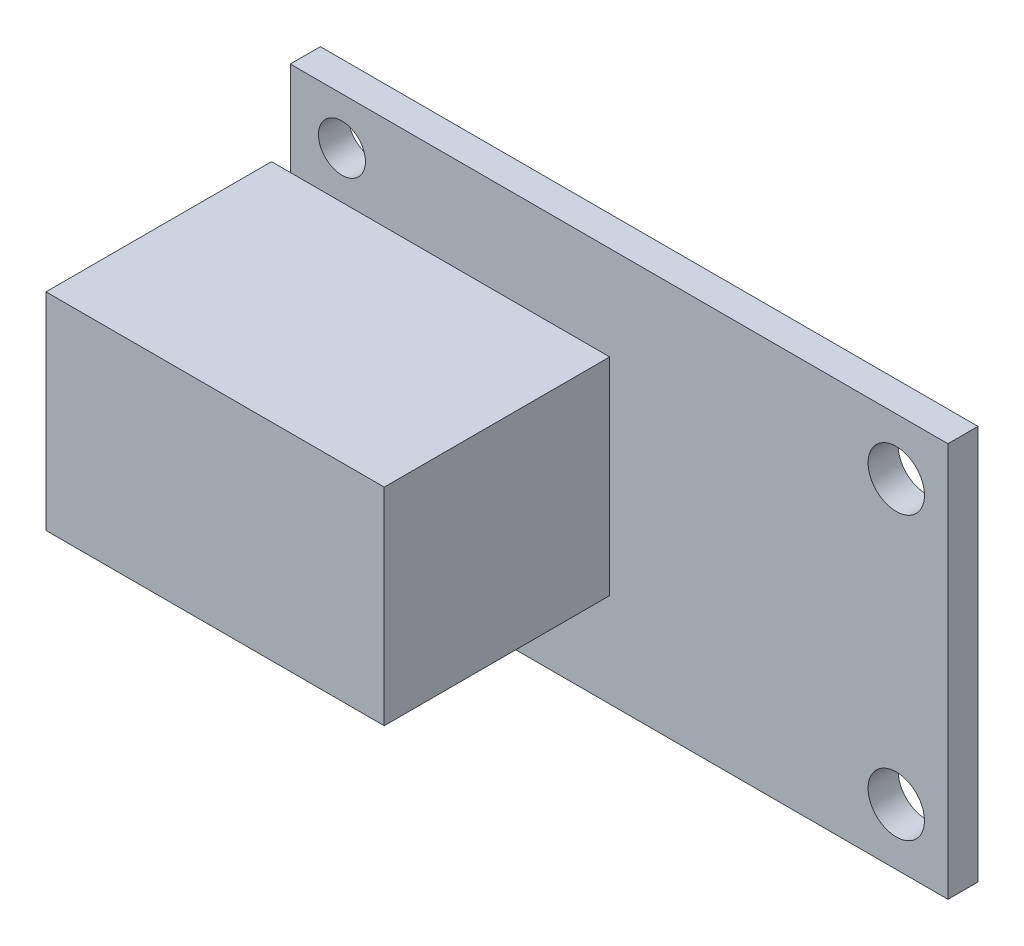
ISO-10303-21;
HEADER;
FILE_DESCRIPTION(('STEP AP214'),'2;1');
FILE_NAME('part.step','',(''),(''),'','','');
FILE_SCHEMA(('AUTOMOTIVE_DESIGN { 1 0 10303 214 1 1 1 1 }'));
ENDSEC;
DATA;
#1=APPLICATION_CONTEXT('core data for automotive mechanical design processes');
#2=APPLICATION_PROTOCOL_DEFINITION('international standard','automotive_design',2000,#1);
#3=PRODUCT_CONTEXT('',#1,'mechanical');
#4=PRODUCT('Part','Part','',(#3));
#5=PRODUCT_RELATED_PRODUCT_CATEGORY('part','',(#4));
#6=PRODUCT_DEFINITION_FORMATION('','',#4);
#7=PRODUCT_DEFINITION_CONTEXT('part definition',#1,'design');
#8=PRODUCT_DEFINITION('design','',#6,#7);
#9=PRODUCT_DEFINITION_SHAPE('','',#8);
#10=(LENGTH_UNIT() NAMED_UNIT(*) SI_UNIT(.MILLI.,.METRE.));
#11=(NAMED_UNIT(*) PLANE_ANGLE_UNIT() SI_UNIT($,.RADIAN.));
#12=(NAMED_UNIT(*) SI_UNIT($,.STERADIAN.) SOLID_ANGLE_UNIT());
#13=UNCERTAINTY_MEASURE_WITH_UNIT(LENGTH_MEASURE(1.E-05),#10,'distance_accuracy_value','');
#14=(GEOMETRIC_REPRESENTATION_CONTEXT(3) GLOBAL_UNCERTAINTY_ASSIGNED_CONTEXT((#13)) GLOBAL_UNIT_ASSIGNED_CONTEXT((#10,
#11,#12)) REPRESENTATION_CONTEXT('',''));
#15=CARTESIAN_POINT('',(0.,0.,0.));
#16=DIRECTION('',(0.,0.,1.));
#17=DIRECTION('',(1.,0.,0.));
#18=AXIS2_PLACEMENT_3D('',#15,#16,#17);
#19=CARTESIAN_POINT('',(-17.5,10.5,1.6));
#20=DIRECTION('',(1.,0.,0.));
#21=DIRECTION('',(0.,1.,0.));
#22=AXIS2_PLACEMENT_3D('',#19,#20,#21);
#23=PLANE('',#22);
#24=DIRECTION('',(0.,-1.,0.));
#25=VECTOR('',#24,1.);
#26=CARTESIAN_POINT('',(-17.5,10.5,0.));
#27=LINE('',#26,#25);
#28=CARTESIAN_POINT('',(-17.5,10.5,0.));
#29=VERTEX_POINT('',#28);
#30=CARTESIAN_POINT('',(-17.5,-10.5,0.));
#31=VERTEX_POINT('',#30);
#32=EDGE_CURVE('E132',#29,#31,#27,.T.);
#33=ORIENTED_EDGE('',*,*,#32,.T.);
#34=DIRECTION('',(0.,0.,-1.));
#35=VECTOR('',#34,1.);
#36=CARTESIAN_POINT('',(-17.5,-10.5,1.6));
#37=LINE('',#36,#35);
#38=CARTESIAN_POINT('',(-17.5,-10.5,1.6));
#39=VERTEX_POINT('',#38);
#40=EDGE_CURVE('E40',#39,#31,#37,.T.);
#41=ORIENTED_EDGE('',*,*,#40,.F.);
#42=DIRECTION('',(0.,-1.,0.));
#43=VECTOR('',#42,1.);
#44=CARTESIAN_POINT('',(-17.5,10.5,1.6));
#45=LINE('',#44,#43);
#46=CARTESIAN_POINT('',(-17.5,-5.49999999999999,1.6));
#47=VERTEX_POINT('',#46);
#48=EDGE_CURVE('E145',#47,#39,#45,.T.);
#49=ORIENTED_EDGE('',*,*,#48,.F.);
#50=CARTESIAN_POINT('',(-17.5,5.5,1.6));
#51=VERTEX_POINT('',#50);
#52=EDGE_CURVE('E144',#51,#47,#45,.T.);
#53=ORIENTED_EDGE('',*,*,#52,.F.);
#54=CARTESIAN_POINT('',(-17.5,10.5,1.6));
#55=VERTEX_POINT('',#54);
#56=EDGE_CURVE('E141',#55,#51,#45,.T.);
#57=ORIENTED_EDGE('',*,*,#56,.F.);
#58=DIRECTION('',(0.,0.,-1.));
#59=VECTOR('',#58,1.);
#60=CARTESIAN_POINT('',(-17.5,10.5,1.6));
#61=LINE('',#60,#59);
#62=EDGE_CURVE('E150',#55,#29,#61,.T.);
#63=ORIENTED_EDGE('',*,*,#62,.T.);
#64=EDGE_LOOP('',(#33,#41,#49,#53,#57,#63));
#65=FACE_BOUND('',#64,.T.);
#66=ADVANCED_FACE('F37',(#65),#23,.F.);
#67=CARTESIAN_POINT('',(-17.5,-10.5,1.6));
#68=DIRECTION('',(0.,1.,0.));
#69=DIRECTION('',(0.,0.,1.));
#70=AXIS2_PLACEMENT_3D('',#67,#68,#69);
#71=PLANE('',#70);
#72=DIRECTION('',(1.,0.,0.));
#73=VECTOR('',#72,1.);
#74=CARTESIAN_POINT('',(-17.5,-10.5,0.));
#75=LINE('',#74,#73);
#76=CARTESIAN_POINT('',(17.5,-10.5,0.));
#77=VERTEX_POINT('',#76);
#78=EDGE_CURVE('E135',#31,#77,#75,.T.);
#79=ORIENTED_EDGE('',*,*,#78,.T.);
#80=DIRECTION('',(0.,0.,-1.));
#81=VECTOR('',#80,1.);
#82=CARTESIAN_POINT('',(17.5,-10.5,1.6));
#83=LINE('',#82,#81);
#84=CARTESIAN_POINT('',(17.5,-10.5,1.6));
#85=VERTEX_POINT('',#84);
#86=EDGE_CURVE('E161',#85,#77,#83,.T.);
#87=ORIENTED_EDGE('',*,*,#86,.F.);
#88=DIRECTION('',(1.,0.,0.));
#89=VECTOR('',#88,1.);
#90=CARTESIAN_POINT('',(-17.5,-10.5,1.6));
#91=LINE('',#90,#89);
#92=EDGE_CURVE('E143',#39,#85,#91,.T.);
#93=ORIENTED_EDGE('',*,*,#92,.F.);
#94=ORIENTED_EDGE('',*,*,#40,.T.);
#95=EDGE_LOOP('',(#79,#87,#93,#94));
#96=FACE_BOUND('',#95,.T.);
#97=ADVANCED_FACE('F171',(#96),#71,.F.);
#98=CARTESIAN_POINT('',(17.5,10.5,1.6));
#99=DIRECTION('',(-1.,0.,0.));
#100=DIRECTION('',(0.,-1.,0.));
#101=AXIS2_PLACEMENT_3D('',#98,#99,#100);
#102=PLANE('',#101);
#103=DIRECTION('',(0.,1.,0.));
#104=VECTOR('',#103,1.);
#105=CARTESIAN_POINT('',(17.5,10.5,0.));
#106=LINE('',#105,#104);
#107=CARTESIAN_POINT('',(17.5,10.5,0.));
#108=VERTEX_POINT('',#107);
#109=EDGE_CURVE('E153',#77,#108,#106,.T.);
#110=ORIENTED_EDGE('',*,*,#109,.T.);
#111=DIRECTION('',(0.,0.,-1.));
#112=VECTOR('',#111,1.);
#113=CARTESIAN_POINT('',(17.5,10.5,1.6));
#114=LINE('',#113,#112);
#115=CARTESIAN_POINT('',(17.5,10.5,1.6));
#116=VERTEX_POINT('',#115);
#117=EDGE_CURVE('E159',#116,#108,#114,.T.);
#118=ORIENTED_EDGE('',*,*,#117,.F.);
#119=DIRECTION('',(0.,1.,0.));
#120=VECTOR('',#119,1.);
#121=CARTESIAN_POINT('',(17.5,10.5,1.6));
#122=LINE('',#121,#120);
#123=EDGE_CURVE('E147',#85,#116,#122,.T.);
#124=ORIENTED_EDGE('',*,*,#123,.F.);
#125=ORIENTED_EDGE('',*,*,#86,.T.);
#126=EDGE_LOOP('',(#110,#118,#124,#125));
#127=FACE_BOUND('',#126,.T.);
#128=ADVANCED_FACE('F180',(#127),#102,.F.);
#129=CARTESIAN_POINT('',(-17.5,10.5,1.6));
#130=DIRECTION('',(0.,-1.,0.));
#131=DIRECTION('',(0.,0.,-1.));
#132=AXIS2_PLACEMENT_3D('',#129,#130,#131);
#133=PLANE('',#132);
#134=DIRECTION('',(-1.,0.,0.));
#135=VECTOR('',#134,1.);
#136=CARTESIAN_POINT('',(-17.5,10.5,0.));
#137=LINE('',#136,#135);
#138=EDGE_CURVE('E155',#108,#29,#137,.T.);
#139=ORIENTED_EDGE('',*,*,#138,.T.);
#140=ORIENTED_EDGE('',*,*,#62,.F.);
#141=DIRECTION('',(-1.,0.,0.));
#142=VECTOR('',#141,1.);
#143=CARTESIAN_POINT('',(-17.5,10.5,1.6));
#144=LINE('',#143,#142);
#145=EDGE_CURVE('E149',#116,#55,#144,.T.);
#146=ORIENTED_EDGE('',*,*,#145,.F.);
#147=ORIENTED_EDGE('',*,*,#117,.T.);
#148=EDGE_LOOP('',(#139,#140,#146,#147));
#149=FACE_BOUND('',#148,.T.);
#150=ADVANCED_FACE('F183',(#149),#133,.F.);
#151=CARTESIAN_POINT('',(0.,0.,1.6));
#152=DIRECTION('',(0.,0.,1.));
#153=DIRECTION('',(1.,0.,0.));
#154=AXIS2_PLACEMENT_3D('',#151,#152,#153);
#155=PLANE('',#154);
#156=CARTESIAN_POINT('',(-14.75,-8.,1.6));
#157=DIRECTION('',(0.,0.,1.));
#158=DIRECTION('',(-1.,0.,0.));
#159=AXIS2_PLACEMENT_3D('',#156,#157,#158);
#160=CIRCLE('',#159,1.25);
#161=CARTESIAN_POINT('',(-16.,-8.,1.6));
#162=VERTEX_POINT('',#161);
#163=EDGE_CURVE('E212',#162,#162,#160,.T.);
#164=ORIENTED_EDGE('',*,*,#163,.F.);
#165=EDGE_LOOP('',(#164));
#166=FACE_BOUND('',#165,.T.);
#167=CARTESIAN_POINT('',(14.75,-7.5,1.6));
#168=DIRECTION('',(0.,0.,1.));
#169=DIRECTION('',(-1.,0.,0.));
#170=AXIS2_PLACEMENT_3D('',#167,#168,#169);
#171=CIRCLE('',#170,1.5);
#172=CARTESIAN_POINT('',(13.25,-7.5,1.6));
#173=VERTEX_POINT('',#172);
#174=EDGE_CURVE('E218',#173,#173,#171,.T.);
#175=ORIENTED_EDGE('',*,*,#174,.F.);
#176=EDGE_LOOP('',(#175));
#177=FACE_BOUND('',#176,.T.);
#178=CARTESIAN_POINT('',(14.75,7.5,1.6));
#179=DIRECTION('',(0.,0.,1.));
#180=DIRECTION('',(1.,0.,0.));
#181=AXIS2_PLACEMENT_3D('',#178,#179,#180);
#182=CIRCLE('',#181,1.49999999999999);
#183=CARTESIAN_POINT('',(16.25,7.5,1.6));
#184=VERTEX_POINT('',#183);
#185=EDGE_CURVE('E224',#184,#184,#182,.T.);
#186=ORIENTED_EDGE('',*,*,#185,.F.);
#187=EDGE_LOOP('',(#186));
#188=FACE_BOUND('',#187,.T.);
#189=CARTESIAN_POINT('',(-14.75,8.,1.6));
#190=DIRECTION('',(0.,0.,1.));
#191=DIRECTION('',(1.,0.,0.));
#192=AXIS2_PLACEMENT_3D('',#189,#190,#191);
#193=CIRCLE('',#192,1.25);
#194=CARTESIAN_POINT('',(-13.5,8.,1.6));
#195=VERTEX_POINT('',#194);
#196=EDGE_CURVE('E206',#195,#195,#193,.T.);
#197=ORIENTED_EDGE('',*,*,#196,.F.);
#198=EDGE_LOOP('',(#197));
#199=FACE_BOUND('',#198,.T.);
#200=DIRECTION('',(-1.,0.,0.));
#201=VECTOR('',#200,1.);
#202=CARTESIAN_POINT('',(-18.5,5.5,1.6));
#203=LINE('',#202,#201);
#204=CARTESIAN_POINT('',(-0.500000000000004,5.5,1.6));
#205=VERTEX_POINT('',#204);
#206=EDGE_CURVE('E53',#205,#51,#203,.T.);
#207=ORIENTED_EDGE('',*,*,#206,.F.);
#208=DIRECTION('',(0.,1.,0.));
#209=VECTOR('',#208,1.);
#210=CARTESIAN_POINT('',(-0.500000000000004,5.5,1.6));
#211=LINE('',#210,#209);
#212=CARTESIAN_POINT('',(-0.500000000000004,-5.5,1.6));
#213=VERTEX_POINT('',#212);
#214=EDGE_CURVE('E190',#213,#205,#211,.T.);
#215=ORIENTED_EDGE('',*,*,#214,.F.);
#216=DIRECTION('',(1.,0.,0.));
#217=VECTOR('',#216,1.);
#218=CARTESIAN_POINT('',(-18.5,-5.5,1.6));
#219=LINE('',#218,#217);
#220=EDGE_CURVE('E11',#47,#213,#219,.T.);
#221=ORIENTED_EDGE('',*,*,#220,.F.);
#222=ORIENTED_EDGE('',*,*,#48,.T.);
#223=ORIENTED_EDGE('',*,*,#92,.T.);
#224=ORIENTED_EDGE('',*,*,#123,.T.);
#225=ORIENTED_EDGE('',*,*,#145,.T.);
#226=ORIENTED_EDGE('',*,*,#56,.T.);
#227=EDGE_LOOP('',(#207,#215,#221,#222,#223,#224,#225,#226));
#228=FACE_BOUND('',#227,.T.);
#229=ADVANCED_FACE('F184',(#166,#177,#188,#199,#228),#155,.T.);
#230=CARTESIAN_POINT('',(0.,0.,0.));
#231=DIRECTION('',(0.,0.,1.));
#232=DIRECTION('',(1.,0.,0.));
#233=AXIS2_PLACEMENT_3D('',#230,#231,#232);
#234=PLANE('',#233);
#235=CARTESIAN_POINT('',(-14.75,-8.,0.));
#236=DIRECTION('',(0.,0.,1.));
#237=DIRECTION('',(-1.,0.,0.));
#238=AXIS2_PLACEMENT_3D('',#235,#236,#237);
#239=CIRCLE('',#238,1.25);
#240=CARTESIAN_POINT('',(-16.,-8.,0.));
#241=VERTEX_POINT('',#240);
#242=EDGE_CURVE('E215',#241,#241,#239,.T.);
#243=ORIENTED_EDGE('',*,*,#242,.T.);
#244=EDGE_LOOP('',(#243));
#245=FACE_BOUND('',#244,.T.);
#246=CARTESIAN_POINT('',(14.75,-7.5,0.));
#247=DIRECTION('',(0.,0.,1.));
#248=DIRECTION('',(-1.,0.,0.));
#249=AXIS2_PLACEMENT_3D('',#246,#247,#248);
#250=CIRCLE('',#249,1.5);
#251=CARTESIAN_POINT('',(13.25,-7.5,0.));
#252=VERTEX_POINT('',#251);
#253=EDGE_CURVE('E221',#252,#252,#250,.T.);
#254=ORIENTED_EDGE('',*,*,#253,.T.);
#255=EDGE_LOOP('',(#254));
#256=FACE_BOUND('',#255,.T.);
#257=CARTESIAN_POINT('',(14.75,7.5,0.));
#258=DIRECTION('',(0.,0.,1.));
#259=DIRECTION('',(1.,0.,0.));
#260=AXIS2_PLACEMENT_3D('',#257,#258,#259);
#261=CIRCLE('',#260,1.49999999999999);
#262=CARTESIAN_POINT('',(16.25,7.5,0.));
#263=VERTEX_POINT('',#262);
#264=EDGE_CURVE('E209',#263,#263,#261,.T.);
#265=ORIENTED_EDGE('',*,*,#264,.T.);
#266=EDGE_LOOP('',(#265));
#267=FACE_BOUND('',#266,.T.);
#268=CARTESIAN_POINT('',(-14.75,8.,0.));
#269=DIRECTION('',(0.,0.,1.));
#270=DIRECTION('',(1.,0.,0.));
#271=AXIS2_PLACEMENT_3D('',#268,#269,#270);
#272=CIRCLE('',#271,1.25);
#273=CARTESIAN_POINT('',(-13.5,8.,0.));
#274=VERTEX_POINT('',#273);
#275=EDGE_CURVE('E192',#274,#274,#272,.T.);
#276=ORIENTED_EDGE('',*,*,#275,.T.);
#277=EDGE_LOOP('',(#276));
#278=FACE_BOUND('',#277,.T.);
#279=ORIENTED_EDGE('',*,*,#32,.F.);
#280=ORIENTED_EDGE('',*,*,#138,.F.);
#281=ORIENTED_EDGE('',*,*,#109,.F.);
#282=ORIENTED_EDGE('',*,*,#78,.F.);
#283=EDGE_LOOP('',(#279,#280,#281,#282));
#284=FACE_BOUND('',#283,.T.);
#285=ADVANCED_FACE('F178',(#245,#256,#267,#278,#284),#234,.F.);
#286=CARTESIAN_POINT('',(0.,0.,1.6));
#287=DIRECTION('',(0.,0.,1.));
#288=DIRECTION('',(1.,0.,0.));
#289=AXIS2_PLACEMENT_3D('',#286,#287,#288);
#290=PLANE('',#289);
#291=CARTESIAN_POINT('',(-18.5,5.5,1.6));
#292=VERTEX_POINT('',#291);
#293=EDGE_CURVE('E189',#51,#292,#203,.T.);
#294=ORIENTED_EDGE('',*,*,#293,.F.);
#295=ORIENTED_EDGE('',*,*,#52,.T.);
#296=CARTESIAN_POINT('',(-18.5,-5.5,1.6));
#297=VERTEX_POINT('',#296);
#298=EDGE_CURVE('E46',#297,#47,#219,.T.);
#299=ORIENTED_EDGE('',*,*,#298,.F.);
#300=DIRECTION('',(0.,-1.,0.));
#301=VECTOR('',#300,1.);
#302=CARTESIAN_POINT('',(-18.5,5.5,1.6));
#303=LINE('',#302,#301);
#304=EDGE_CURVE('E131',#292,#297,#303,.T.);
#305=ORIENTED_EDGE('',*,*,#304,.F.);
#306=EDGE_LOOP('',(#294,#295,#299,#305));
#307=FACE_BOUND('',#306,.T.);
#308=ADVANCED_FACE('F188',(#307),#290,.F.);
#309=CARTESIAN_POINT('',(-18.5,5.5,13.6));
#310=DIRECTION('',(1.,0.,0.));
#311=DIRECTION('',(0.,0.,-1.));
#312=AXIS2_PLACEMENT_3D('',#309,#310,#311);
#313=PLANE('',#312);
#314=ORIENTED_EDGE('',*,*,#304,.T.);
#315=DIRECTION('',(0.,0.,-1.));
#316=VECTOR('',#315,1.);
#317=CARTESIAN_POINT('',(-18.5,-5.5,13.6));
#318=LINE('',#317,#316);
#319=CARTESIAN_POINT('',(-18.5,-5.5,13.6));
#320=VERTEX_POINT('',#319);
#321=EDGE_CURVE('E112',#320,#297,#318,.T.);
#322=ORIENTED_EDGE('',*,*,#321,.F.);
#323=DIRECTION('',(0.,-1.,0.));
#324=VECTOR('',#323,1.);
#325=CARTESIAN_POINT('',(-18.5,5.5,13.6));
#326=LINE('',#325,#324);
#327=CARTESIAN_POINT('',(-18.5,5.5,13.6));
#328=VERTEX_POINT('',#327);
#329=EDGE_CURVE('E119',#328,#320,#326,.T.);
#330=ORIENTED_EDGE('',*,*,#329,.F.);
#331=DIRECTION('',(0.,0.,-1.));
#332=VECTOR('',#331,1.);
#333=CARTESIAN_POINT('',(-18.5,5.5,13.6));
#334=LINE('',#333,#332);
#335=EDGE_CURVE('E197',#328,#292,#334,.T.);
#336=ORIENTED_EDGE('',*,*,#335,.T.);
#337=EDGE_LOOP('',(#314,#322,#330,#336));
#338=FACE_BOUND('',#337,.T.);
#339=ADVANCED_FACE('F129',(#338),#313,.F.);
#340=CARTESIAN_POINT('',(-18.5,-5.5,13.6));
#341=DIRECTION('',(0.,1.,0.));
#342=DIRECTION('',(0.,0.,1.));
#343=AXIS2_PLACEMENT_3D('',#340,#341,#342);
#344=PLANE('',#343);
#345=ORIENTED_EDGE('',*,*,#298,.T.);
#346=ORIENTED_EDGE('',*,*,#220,.T.);
#347=DIRECTION('',(0.,0.,-1.));
#348=VECTOR('',#347,1.);
#349=CARTESIAN_POINT('',(-0.500000000000004,-5.5,13.6));
#350=LINE('',#349,#348);
#351=CARTESIAN_POINT('',(-0.500000000000004,-5.5,13.6));
#352=VERTEX_POINT('',#351);
#353=EDGE_CURVE('E115',#352,#213,#350,.T.);
#354=ORIENTED_EDGE('',*,*,#353,.F.);
#355=DIRECTION('',(1.,0.,0.));
#356=VECTOR('',#355,1.);
#357=CARTESIAN_POINT('',(-18.5,-5.5,13.6));
#358=LINE('',#357,#356);
#359=EDGE_CURVE('E107',#320,#352,#358,.T.);
#360=ORIENTED_EDGE('',*,*,#359,.F.);
#361=ORIENTED_EDGE('',*,*,#321,.T.);
#362=EDGE_LOOP('',(#345,#346,#354,#360,#361));
#363=FACE_BOUND('',#362,.T.);
#364=ADVANCED_FACE('F110',(#363),#344,.F.);
#365=CARTESIAN_POINT('',(-0.500000000000004,5.5,13.6));
#366=DIRECTION('',(-1.,0.,0.));
#367=DIRECTION('',(0.,0.,1.));
#368=AXIS2_PLACEMENT_3D('',#365,#366,#367);
#369=PLANE('',#368);
#370=ORIENTED_EDGE('',*,*,#214,.T.);
#371=DIRECTION('',(0.,0.,-1.));
#372=VECTOR('',#371,1.);
#373=CARTESIAN_POINT('',(-0.500000000000004,5.5,13.6));
#374=LINE('',#373,#372);
#375=CARTESIAN_POINT('',(-0.500000000000004,5.5,13.6));
#376=VERTEX_POINT('',#375);
#377=EDGE_CURVE('E137',#376,#205,#374,.T.);
#378=ORIENTED_EDGE('',*,*,#377,.F.);
#379=DIRECTION('',(0.,1.,0.));
#380=VECTOR('',#379,1.);
#381=CARTESIAN_POINT('',(-0.500000000000004,5.5,13.6));
#382=LINE('',#381,#380);
#383=EDGE_CURVE('E118',#352,#376,#382,.T.);
#384=ORIENTED_EDGE('',*,*,#383,.F.);
#385=ORIENTED_EDGE('',*,*,#353,.T.);
#386=EDGE_LOOP('',(#370,#378,#384,#385));
#387=FACE_BOUND('',#386,.T.);
#388=ADVANCED_FACE('F203',(#387),#369,.F.);
#389=CARTESIAN_POINT('',(-18.5,5.5,13.6));
#390=DIRECTION('',(0.,-1.,0.));
#391=DIRECTION('',(0.,0.,-1.));
#392=AXIS2_PLACEMENT_3D('',#389,#390,#391);
#393=PLANE('',#392);
#394=ORIENTED_EDGE('',*,*,#206,.T.);
#395=ORIENTED_EDGE('',*,*,#293,.T.);
#396=ORIENTED_EDGE('',*,*,#335,.F.);
#397=DIRECTION('',(-1.,0.,0.));
#398=VECTOR('',#397,1.);
#399=CARTESIAN_POINT('',(-18.5,5.5,13.6));
#400=LINE('',#399,#398);
#401=EDGE_CURVE('E124',#376,#328,#400,.T.);
#402=ORIENTED_EDGE('',*,*,#401,.F.);
#403=ORIENTED_EDGE('',*,*,#377,.T.);
#404=EDGE_LOOP('',(#394,#395,#396,#402,#403));
#405=FACE_BOUND('',#404,.T.);
#406=ADVANCED_FACE('F201',(#405),#393,.F.);
#407=CARTESIAN_POINT('',(0.,0.,13.6));
#408=DIRECTION('',(0.,0.,1.));
#409=DIRECTION('',(1.,0.,0.));
#410=AXIS2_PLACEMENT_3D('',#407,#408,#409);
#411=PLANE('',#410);
#412=ORIENTED_EDGE('',*,*,#329,.T.);
#413=ORIENTED_EDGE('',*,*,#359,.T.);
#414=ORIENTED_EDGE('',*,*,#383,.T.);
#415=ORIENTED_EDGE('',*,*,#401,.T.);
#416=EDGE_LOOP('',(#412,#413,#414,#415));
#417=FACE_BOUND('',#416,.T.);
#418=ADVANCED_FACE('F122',(#417),#411,.T.);
#419=CARTESIAN_POINT('',(-14.75,8.,0.));
#420=DIRECTION('',(0.,0.,1.));
#421=DIRECTION('',(1.,0.,0.));
#422=AXIS2_PLACEMENT_3D('',#419,#420,#421);
#423=CYLINDRICAL_SURFACE('',#422,1.25);
#424=ORIENTED_EDGE('',*,*,#275,.F.);
#425=EDGE_LOOP('',(#424));
#426=FACE_BOUND('',#425,.T.);
#427=ORIENTED_EDGE('',*,*,#196,.T.);
#428=EDGE_LOOP('',(#427));
#429=FACE_BOUND('',#428,.T.);
#430=ADVANCED_FACE('F236',(#426,#429),#423,.F.);
#431=CARTESIAN_POINT('',(14.75,7.5,0.));
#432=DIRECTION('',(0.,0.,1.));
#433=DIRECTION('',(1.,0.,0.));
#434=AXIS2_PLACEMENT_3D('',#431,#432,#433);
#435=CYLINDRICAL_SURFACE('',#434,1.49999999999999);
#436=ORIENTED_EDGE('',*,*,#264,.F.);
#437=EDGE_LOOP('',(#436));
#438=FACE_BOUND('',#437,.T.);
#439=ORIENTED_EDGE('',*,*,#185,.T.);
#440=EDGE_LOOP('',(#439));
#441=FACE_BOUND('',#440,.T.);
#442=ADVANCED_FACE('F232',(#438,#441),#435,.F.);
#443=CARTESIAN_POINT('',(14.75,-7.5,0.));
#444=DIRECTION('',(0.,0.,1.));
#445=DIRECTION('',(1.,0.,0.));
#446=AXIS2_PLACEMENT_3D('',#443,#444,#445);
#447=CYLINDRICAL_SURFACE('',#446,1.5);
#448=ORIENTED_EDGE('',*,*,#253,.F.);
#449=EDGE_LOOP('',(#448));
#450=FACE_BOUND('',#449,.T.);
#451=ORIENTED_EDGE('',*,*,#174,.T.);
#452=EDGE_LOOP('',(#451));
#453=FACE_BOUND('',#452,.T.);
#454=ADVANCED_FACE('F235',(#450,#453),#447,.F.);
#455=CARTESIAN_POINT('',(-14.75,-8.,0.));
#456=DIRECTION('',(0.,0.,1.));
#457=DIRECTION('',(1.,0.,0.));
#458=AXIS2_PLACEMENT_3D('',#455,#456,#457);
#459=CYLINDRICAL_SURFACE('',#458,1.25);
#460=ORIENTED_EDGE('',*,*,#242,.F.);
#461=EDGE_LOOP('',(#460));
#462=FACE_BOUND('',#461,.T.);
#463=ORIENTED_EDGE('',*,*,#163,.T.);
#464=EDGE_LOOP('',(#463));
#465=FACE_BOUND('',#464,.T.);
#466=ADVANCED_FACE('F332',(#462,#465),#459,.F.);
#467=CLOSED_SHELL('',(#66,#97,#128,#150,#229,#285,#308,#339,#364,#388,#406,#418,#430,#442,#454,#466));
#468=MANIFOLD_SOLID_BREP('B2',#467);
#469=ADVANCED_BREP_SHAPE_REPRESENTATION('',(#18,#468),#14);
#470=SHAPE_DEFINITION_REPRESENTATION(#9,#469);
ENDSEC;
END-ISO-10303-21;
